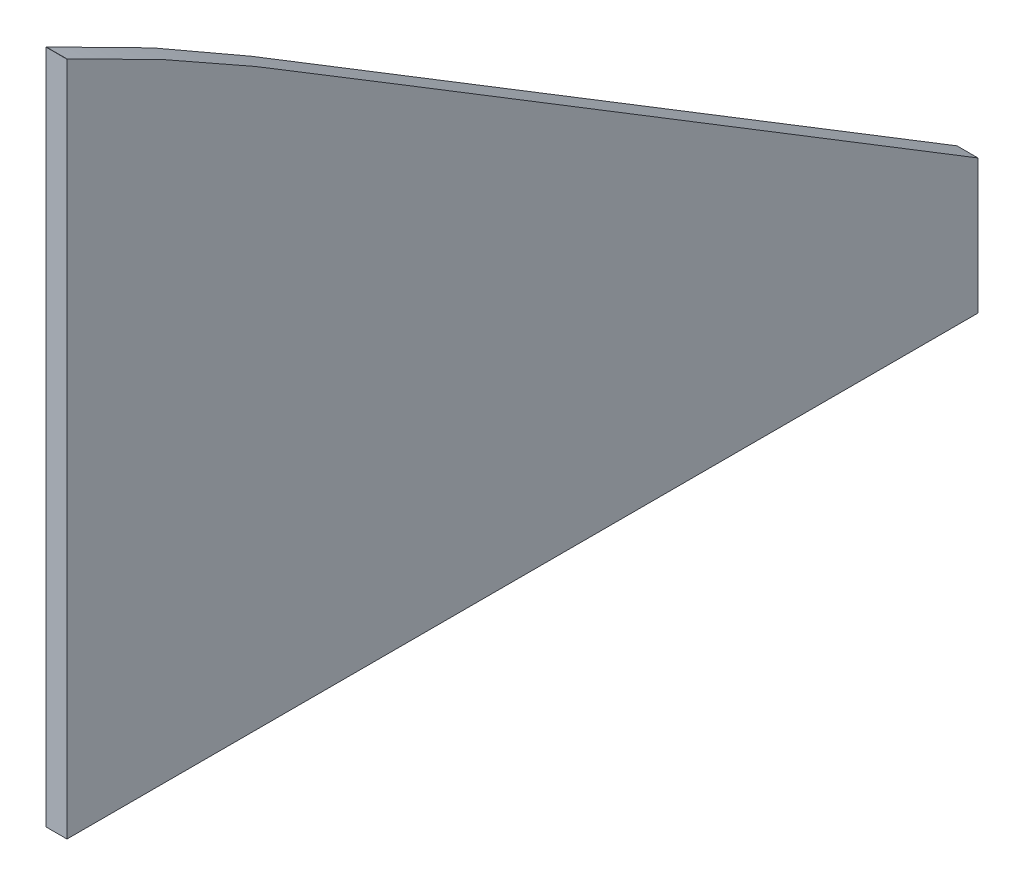
ISO-10303-21;
HEADER;
FILE_DESCRIPTION(('STEP AP214'),'2;1');
FILE_NAME('part.step','',(''),(''),'','','');
FILE_SCHEMA(('AUTOMOTIVE_DESIGN { 1 0 10303 214 1 1 1 1 }'));
ENDSEC;
DATA;
#1=APPLICATION_CONTEXT('core data for automotive mechanical design processes');
#2=APPLICATION_PROTOCOL_DEFINITION('international standard','automotive_design',2000,#1);
#3=PRODUCT_CONTEXT('',#1,'mechanical');
#4=PRODUCT('Part','Part','',(#3));
#5=PRODUCT_RELATED_PRODUCT_CATEGORY('part','',(#4));
#6=PRODUCT_DEFINITION_FORMATION('','',#4);
#7=PRODUCT_DEFINITION_CONTEXT('part definition',#1,'design');
#8=PRODUCT_DEFINITION('design','',#6,#7);
#9=PRODUCT_DEFINITION_SHAPE('','',#8);
#10=(LENGTH_UNIT() NAMED_UNIT(*) SI_UNIT(.MILLI.,.METRE.));
#11=(NAMED_UNIT(*) PLANE_ANGLE_UNIT() SI_UNIT($,.RADIAN.));
#12=(NAMED_UNIT(*) SI_UNIT($,.STERADIAN.) SOLID_ANGLE_UNIT());
#13=UNCERTAINTY_MEASURE_WITH_UNIT(LENGTH_MEASURE(1.E-05),#10,'distance_accuracy_value','');
#14=(GEOMETRIC_REPRESENTATION_CONTEXT(3) GLOBAL_UNCERTAINTY_ASSIGNED_CONTEXT((#13)) GLOBAL_UNIT_ASSIGNED_CONTEXT((#10,
#11,#12)) REPRESENTATION_CONTEXT('',''));
#15=CARTESIAN_POINT('',(0.,0.,0.));
#16=DIRECTION('',(0.,0.,1.));
#17=DIRECTION('',(1.,0.,0.));
#18=AXIS2_PLACEMENT_3D('',#15,#16,#17);
#19=CARTESIAN_POINT('',(710.,424.00019339282,182.938614186098));
#20=DIRECTION('',(1.,0.,0.));
#21=DIRECTION('',(0.,1.,0.));
#22=AXIS2_PLACEMENT_3D('',#19,#20,#21);
#23=PLANE('',#22);
#24=CARTESIAN_POINT('',(710.,327.113728556052,-34.1227716278049));
#25=CARTESIAN_POINT('',(710.,393.948717499599,75.437130923735));
#26=CARTESIAN_POINT('',(710.,460.783706443145,184.997033475275));
#27=CARTESIAN_POINT('',(710.,527.618695386692,294.556936026815));
#28=CARTESIAN_POINT('',(710.,530.739682456954,299.673044291176));
#29=CARTESIAN_POINT('',(710.,533.81640505228,304.787373011843));
#30=CARTESIAN_POINT('',(710.,536.841338937679,309.890563191029));
#31=CARTESIAN_POINT('',(710.,536.912160954527,310.010042900187));
#32=CARTESIAN_POINT('',(710.,537.042611539758,310.230138132512));
#33=CARTESIAN_POINT('',(710.,537.225130506718,310.538445208813));
#34=CARTESIAN_POINT('',(710.,546.500562042383,326.206302779104));
#35=CARTESIAN_POINT('',(710.,555.261116454356,341.70362097195));
#36=CARTESIAN_POINT('',(710.,563.692773588629,357.536212878907));
#37=CARTESIAN_POINT('',(710.,570.135366088416,369.633827410377));
#38=CARTESIAN_POINT('',(710.,575.897239710819,380.982203809807));
#39=CARTESIAN_POINT('',(710.,581.589691060234,392.853860253918));
#40=CARTESIAN_POINT('',(710.,582.708067356299,395.186243676656));
#41=CARTESIAN_POINT('',(710.,583.815706068801,397.523597262797));
#42=CARTESIAN_POINT('',(710.,584.911639993194,399.865461804627));
#43=(BOUNDED_CURVE() B_SPLINE_CURVE(3,(#24,#25,#26,#27,#28,#29,#30,#31,#32,#33,#34,#35,#36,#37,
#38,#39,#40,#41,#42),.UNSPECIFIED.,.F.,.F.) B_SPLINE_CURVE_WITH_KNOTS((4,3,3,3,3,3,4),
(0.0585691557129306,51.281799015553,53.673765268808,53.7297677735588,56.5757591096677,
58.7503686964292,59.1776067465671),
.UNSPECIFIED.) CURVE() GEOMETRIC_REPRESENTATION_ITEM() RATIONAL_B_SPLINE_CURVE((1.,1.,1.,1.,1.,
1.,1.,1.,1.,1.,1.,1.,1.,1.,1.,1.,1.,1.,1.)) REPRESENTATION_ITEM(''));
#44=CARTESIAN_POINT('',(710.,327.113728556052,-34.122771627805));
#45=VERTEX_POINT('',#44);
#46=CARTESIAN_POINT('',(710.,584.911639993194,399.865461804627));
#47=VERTEX_POINT('',#46);
#48=EDGE_CURVE('E102',#45,#47,#43,.T.);
#49=ORIENTED_EDGE('',*,*,#48,.T.);
#50=DIRECTION('',(0.,0.,1.));
#51=VECTOR('',#50,1.);
#52=CARTESIAN_POINT('',(710.,584.911639993194,-34.122771627805));
#53=LINE('',#52,#51);
#54=CARTESIAN_POINT('',(710.,584.911639993194,400.));
#55=VERTEX_POINT('',#54);
#56=EDGE_CURVE('E95',#47,#55,#53,.T.);
#57=ORIENTED_EDGE('',*,*,#56,.T.);
#58=DIRECTION('',(0.,-1.,0.));
#59=VECTOR('',#58,1.);
#60=CARTESIAN_POINT('',(710.,584.911639993194,400.));
#61=LINE('',#60,#59);
#62=CARTESIAN_POINT('',(710.,263.088746792446,400.));
#63=VERTEX_POINT('',#62);
#64=EDGE_CURVE('E91',#55,#63,#61,.T.);
#65=ORIENTED_EDGE('',*,*,#64,.T.);
#66=DIRECTION('',(0.,0.,-1.));
#67=VECTOR('',#66,1.);
#68=CARTESIAN_POINT('',(710.,263.088746792446,400.));
#69=LINE('',#68,#67);
#70=CARTESIAN_POINT('',(710.,263.088746792446,-34.122771627805));
#71=VERTEX_POINT('',#70);
#72=EDGE_CURVE('E10',#63,#71,#69,.T.);
#73=ORIENTED_EDGE('',*,*,#72,.T.);
#74=DIRECTION('',(0.,1.,0.));
#75=VECTOR('',#74,1.);
#76=CARTESIAN_POINT('',(710.,263.088746792446,-34.122771627805));
#77=LINE('',#76,#75);
#78=EDGE_CURVE('E135',#71,#45,#77,.T.);
#79=ORIENTED_EDGE('',*,*,#78,.T.);
#80=EDGE_LOOP('',(#49,#57,#65,#73,#79));
#81=FACE_BOUND('',#80,.T.);
#82=ADVANCED_FACE('F15',(#81),#23,.T.);
#83=CARTESIAN_POINT('',(700.,263.088746792446,400.));
#84=DIRECTION('',(0.,-1.,0.));
#85=DIRECTION('',(0.,0.,-1.));
#86=AXIS2_PLACEMENT_3D('',#83,#84,#85);
#87=PLANE('',#86);
#88=DIRECTION('',(0.,0.,-1.));
#89=VECTOR('',#88,1.);
#90=CARTESIAN_POINT('',(700.,263.088746792446,400.));
#91=LINE('',#90,#89);
#92=CARTESIAN_POINT('',(700.,263.088746792446,400.));
#93=VERTEX_POINT('',#92);
#94=CARTESIAN_POINT('',(700.,263.088746792446,-34.122771627805));
#95=VERTEX_POINT('',#94);
#96=EDGE_CURVE('E82',#93,#95,#91,.T.);
#97=ORIENTED_EDGE('',*,*,#96,.T.);
#98=DIRECTION('',(1.,0.,0.));
#99=VECTOR('',#98,1.);
#100=CARTESIAN_POINT('',(700.,263.088746792446,-34.122771627805));
#101=LINE('',#100,#99);
#102=EDGE_CURVE('E28',#95,#71,#101,.T.);
#103=ORIENTED_EDGE('',*,*,#102,.T.);
#104=ORIENTED_EDGE('',*,*,#72,.F.);
#105=DIRECTION('',(1.,0.,0.));
#106=VECTOR('',#105,1.);
#107=CARTESIAN_POINT('',(700.,263.088746792446,400.));
#108=LINE('',#107,#106);
#109=EDGE_CURVE('E86',#93,#63,#108,.T.);
#110=ORIENTED_EDGE('',*,*,#109,.F.);
#111=EDGE_LOOP('',(#97,#103,#104,#110));
#112=FACE_BOUND('',#111,.T.);
#113=ADVANCED_FACE('F17',(#112),#87,.T.);
#114=CARTESIAN_POINT('',(700.,263.088746792446,-34.122771627805));
#115=DIRECTION('',(0.,0.,-1.));
#116=DIRECTION('',(0.,-1.,0.));
#117=AXIS2_PLACEMENT_3D('',#114,#115,#116);
#118=PLANE('',#117);
#119=CARTESIAN_POINT('',(700.,327.113728556052,-34.122771627805));
#120=CARTESIAN_POINT('',(703.333333333334,327.113728556052,-34.122771627805));
#121=CARTESIAN_POINT('',(706.666666666666,327.113728556052,-34.122771627805));
#122=CARTESIAN_POINT('',(710.,327.113728556052,-34.122771627805));
#123=(BOUNDED_CURVE() B_SPLINE_CURVE(3,(#119,#120,#121,#122),.UNSPECIFIED.,.F.,
.F.) B_SPLINE_CURVE_WITH_KNOTS((4,4),(0.049999999999998,1.05000000000009),
.UNSPECIFIED.) CURVE() GEOMETRIC_REPRESENTATION_ITEM() RATIONAL_B_SPLINE_CURVE((1.,1.,1.,1.)) REPRESENTATION_ITEM(''));
#124=CARTESIAN_POINT('',(700.,327.113728556052,-34.122771627805));
#125=VERTEX_POINT('',#124);
#126=EDGE_CURVE('E112',#125,#45,#123,.T.);
#127=ORIENTED_EDGE('',*,*,#126,.T.);
#128=ORIENTED_EDGE('',*,*,#78,.F.);
#129=ORIENTED_EDGE('',*,*,#102,.F.);
#130=DIRECTION('',(0.,1.,0.));
#131=VECTOR('',#130,1.);
#132=CARTESIAN_POINT('',(700.,263.088746792446,-34.122771627805));
#133=LINE('',#132,#131);
#134=EDGE_CURVE('E125',#95,#125,#133,.T.);
#135=ORIENTED_EDGE('',*,*,#134,.T.);
#136=EDGE_LOOP('',(#127,#128,#129,#135));
#137=FACE_BOUND('',#136,.T.);
#138=ADVANCED_FACE('F161',(#137),#118,.T.);
#139=CARTESIAN_POINT('',(700.,584.911639993194,400.));
#140=DIRECTION('',(0.,0.,1.));
#141=DIRECTION('',(1.,0.,0.));
#142=AXIS2_PLACEMENT_3D('',#139,#140,#141);
#143=PLANE('',#142);
#144=DIRECTION('',(0.,-1.,0.));
#145=VECTOR('',#144,1.);
#146=CARTESIAN_POINT('',(700.,584.911639993194,400.));
#147=LINE('',#146,#145);
#148=CARTESIAN_POINT('',(700.,584.911639993194,400.));
#149=VERTEX_POINT('',#148);
#150=EDGE_CURVE('E73',#149,#93,#147,.T.);
#151=ORIENTED_EDGE('',*,*,#150,.T.);
#152=ORIENTED_EDGE('',*,*,#109,.T.);
#153=ORIENTED_EDGE('',*,*,#64,.F.);
#154=DIRECTION('',(1.,0.,0.));
#155=VECTOR('',#154,1.);
#156=CARTESIAN_POINT('',(700.,584.911639993194,400.));
#157=LINE('',#156,#155);
#158=EDGE_CURVE('E89',#149,#55,#157,.T.);
#159=ORIENTED_EDGE('',*,*,#158,.F.);
#160=EDGE_LOOP('',(#151,#152,#153,#159));
#161=FACE_BOUND('',#160,.T.);
#162=ADVANCED_FACE('F90',(#161),#143,.T.);
#163=CARTESIAN_POINT('',(700.,424.00019339282,182.938614186098));
#164=DIRECTION('',(1.,0.,0.));
#165=DIRECTION('',(0.,1.,0.));
#166=AXIS2_PLACEMENT_3D('',#163,#164,#165);
#167=PLANE('',#166);
#168=CARTESIAN_POINT('',(700.,584.911639993194,399.865461804627));
#169=CARTESIAN_POINT('',(700.,583.815706068801,397.523597262797));
#170=CARTESIAN_POINT('',(700.,582.708067356299,395.186243676656));
#171=CARTESIAN_POINT('',(700.,581.589691060234,392.853860253918));
#172=CARTESIAN_POINT('',(700.,575.897239710819,380.982203809807));
#173=CARTESIAN_POINT('',(700.,570.135366088416,369.633827410377));
#174=CARTESIAN_POINT('',(700.,563.692773588629,357.536212878907));
#175=CARTESIAN_POINT('',(700.,555.261116454356,341.70362097195));
#176=CARTESIAN_POINT('',(700.,546.500562042383,326.206302779104));
#177=CARTESIAN_POINT('',(700.,537.225130506718,310.538445208813));
#178=CARTESIAN_POINT('',(700.,537.042611539758,310.230138132512));
#179=CARTESIAN_POINT('',(700.,536.912160954527,310.010042900187));
#180=CARTESIAN_POINT('',(700.,536.841338937679,309.890563191029));
#181=CARTESIAN_POINT('',(700.,533.81640505228,304.787373011843));
#182=CARTESIAN_POINT('',(700.,530.739682456954,299.673044291176));
#183=CARTESIAN_POINT('',(700.,527.618695386692,294.556936026815));
#184=CARTESIAN_POINT('',(700.,460.783706443145,184.997033475275));
#185=CARTESIAN_POINT('',(700.,393.948717499598,75.4371309237349));
#186=CARTESIAN_POINT('',(700.,327.113728556052,-34.1227716278051));
#187=(BOUNDED_CURVE() B_SPLINE_CURVE(3,(#168,#169,#170,#171,#172,#173,#174,#175,#176,#177,#178,
#179,#180,#181,#182,#183,#184,#185,#186),.UNSPECIFIED.,.F.,.F.) B_SPLINE_CURVE_WITH_KNOTS((4,3,
3,3,3,3,4),(0.0700692870585055,0.895610685332444,5.09755439885545,10.5967922741532,
10.7050045133577,15.3269410770571,114.304306948254),
.UNSPECIFIED.) CURVE() GEOMETRIC_REPRESENTATION_ITEM() RATIONAL_B_SPLINE_CURVE((1.,1.,1.,1.,1.,
1.,1.,1.,1.,1.,1.,1.,1.,1.,1.,1.,1.,1.,1.)) REPRESENTATION_ITEM(''));
#188=CARTESIAN_POINT('',(700.,584.911639993194,399.865461804627));
#189=VERTEX_POINT('',#188);
#190=EDGE_CURVE('E19',#189,#125,#187,.T.);
#191=ORIENTED_EDGE('',*,*,#190,.T.);
#192=ORIENTED_EDGE('',*,*,#134,.F.);
#193=ORIENTED_EDGE('',*,*,#96,.F.);
#194=ORIENTED_EDGE('',*,*,#150,.F.);
#195=DIRECTION('',(0.,0.,1.));
#196=VECTOR('',#195,1.);
#197=CARTESIAN_POINT('',(700.,584.911639993194,-34.122771627805));
#198=LINE('',#197,#196);
#199=EDGE_CURVE('E78',#189,#149,#198,.T.);
#200=ORIENTED_EDGE('',*,*,#199,.F.);
#201=EDGE_LOOP('',(#191,#192,#193,#194,#200));
#202=FACE_BOUND('',#201,.T.);
#203=ADVANCED_FACE('F76',(#202),#167,.F.);
#204=CARTESIAN_POINT('',(700.,584.911639993194,-34.122771627805));
#205=DIRECTION('',(0.,1.,0.));
#206=DIRECTION('',(1.,0.,0.));
#207=AXIS2_PLACEMENT_3D('',#204,#205,#206);
#208=PLANE('',#207);
#209=CARTESIAN_POINT('',(710.,584.911639993194,399.865461804627));
#210=CARTESIAN_POINT('',(706.666666666666,584.911639993194,399.865461804627));
#211=CARTESIAN_POINT('',(703.333333333333,584.911639993194,399.865461804627));
#212=CARTESIAN_POINT('',(700.,584.911639993194,399.865461804627));
#213=(BOUNDED_CURVE() B_SPLINE_CURVE(3,(#209,#210,#211,#212),.UNSPECIFIED.,.F.,
.F.) B_SPLINE_CURVE_WITH_KNOTS((4,4),(0.0499999999999829,1.04999999999998),
.UNSPECIFIED.) CURVE() GEOMETRIC_REPRESENTATION_ITEM() RATIONAL_B_SPLINE_CURVE((1.,1.,1.,1.)) REPRESENTATION_ITEM(''));
#214=EDGE_CURVE('E99',#47,#189,#213,.T.);
#215=ORIENTED_EDGE('',*,*,#214,.T.);
#216=ORIENTED_EDGE('',*,*,#199,.T.);
#217=ORIENTED_EDGE('',*,*,#158,.T.);
#218=ORIENTED_EDGE('',*,*,#56,.F.);
#219=EDGE_LOOP('',(#215,#216,#217,#218));
#220=FACE_BOUND('',#219,.T.);
#221=ADVANCED_FACE('F97',(#220),#208,.T.);
#222=CARTESIAN_POINT('',(-362.256097932323,-572.204246657164,943.480926716199));
#223=CARTESIAN_POINT('',(1771.25609793232,-572.204246657164,943.480926716199));
#224=CARTESIAN_POINT('',(-362.256097932323,-229.804955533969,868.942411403719));
#225=CARTESIAN_POINT('',(1771.25609793232,-229.804955533969,868.942411403719));
#226=CARTESIAN_POINT('',(-362.256097932323,112.594335589226,794.40389609124));
#227=CARTESIAN_POINT('',(1771.25609793232,112.594335589226,794.40389609124));
#228=CARTESIAN_POINT('',(-362.256097932323,454.993626712421,719.86538077876));
#229=CARTESIAN_POINT('',(1771.25609793232,454.993626712421,719.86538077876));
#230=CARTESIAN_POINT('',(-362.256097932323,468.480912210163,716.929270037118));
#231=CARTESIAN_POINT('',(1771.25609793232,468.480912210163,716.929270037118));
#232=CARTESIAN_POINT('',(-362.256097932323,481.509221547537,713.534209086195));
#233=CARTESIAN_POINT('',(1771.25609793232,481.509221547537,713.534209086195));
#234=CARTESIAN_POINT('',(-362.256097932323,505.778577342356,705.930079253447));
#235=CARTESIAN_POINT('',(1771.25609793232,505.778577342356,705.930079253447));
#236=CARTESIAN_POINT('',(-362.256097932323,517.346606095361,701.68960208267));
#237=CARTESIAN_POINT('',(1771.25609793232,517.346606095361,701.68960208267));
#238=CARTESIAN_POINT('',(-362.256097932323,549.587093772607,687.521897093088));
#239=CARTESIAN_POINT('',(1771.25609793232,549.587093772607,687.521897093088));
#240=CARTESIAN_POINT('',(-362.256097932323,569.212922758717,675.850530006688));
#241=CARTESIAN_POINT('',(1771.25609793232,569.212922758717,675.850530006688));
#242=CARTESIAN_POINT('',(-362.256097932323,589.661749786182,657.05552894535));
#243=CARTESIAN_POINT('',(1771.25609793232,589.661749786182,657.05552894535));
#244=CARTESIAN_POINT('',(-362.256097932323,593.486469066028,653.113332671797));
#245=CARTESIAN_POINT('',(1771.25609793232,593.486469066028,653.113332671797));
#246=CARTESIAN_POINT('',(-362.256097932323,603.206027635225,641.831734383769));
#247=CARTESIAN_POINT('',(1771.25609793232,603.206027635225,641.831734383769));
#248=CARTESIAN_POINT('',(-362.256097932323,608.417423885158,634.335573435164));
#249=CARTESIAN_POINT('',(1771.25609793232,608.417423885158,634.335573435164));
#250=CARTESIAN_POINT('',(-362.256097932323,616.407741978553,619.611196325145));
#251=CARTESIAN_POINT('',(1771.25609793232,616.407741978553,619.611196325145));
#252=CARTESIAN_POINT('',(-362.256097932323,618.688401111678,614.005256601817));
#253=CARTESIAN_POINT('',(1771.25609793232,618.688401111678,614.005256601817));
#254=CARTESIAN_POINT('',(-362.256097932323,621.298027563217,606.9397748753));
#255=CARTESIAN_POINT('',(1771.25609793232,621.298027563217,606.9397748753));
#256=CARTESIAN_POINT('',(-362.256097932323,622.3037982907,603.872941193098));
#257=CARTESIAN_POINT('',(1771.25609793232,622.3037982907,603.872941193098));
#258=CARTESIAN_POINT('',(-362.256097932323,624.214729362039,597.206111280268));
#259=CARTESIAN_POINT('',(1771.25609793232,624.214729362039,597.206111280268));
#260=CARTESIAN_POINT('',(-362.256097932323,625.08166794729,593.640291488809));
#261=CARTESIAN_POINT('',(1771.25609793232,625.08166794729,593.640291488809));
#262=CARTESIAN_POINT('',(-362.256097932323,627.509269020286,581.589934632535));
#263=CARTESIAN_POINT('',(1771.25609793232,627.509269020286,581.589934632535));
#264=CARTESIAN_POINT('',(-362.256097932323,628.433907017217,573.03902661471));
#265=CARTESIAN_POINT('',(1771.25609793232,628.433907017217,573.03902661471));
#266=CARTESIAN_POINT('',(-362.256097932323,628.833198184814,562.151204848578));
#267=CARTESIAN_POINT('',(1771.25609793232,628.833198184814,562.151204848578));
#268=CARTESIAN_POINT('',(-362.256097932323,628.868088907446,559.809652350947));
#269=CARTESIAN_POINT('',(1771.25609793232,628.868088907446,559.809652350947));
#270=CARTESIAN_POINT('',(-362.256097932323,628.847508177946,546.74086786728));
#271=CARTESIAN_POINT('',(1771.25609793232,628.847508177946,546.74086786728));
#272=CARTESIAN_POINT('',(-362.256097932323,627.897194469519,535.80856309446));
#273=CARTESIAN_POINT('',(1771.25609793232,627.897194469519,535.80856309446));
#274=CARTESIAN_POINT('',(-362.256097932323,625.284219654465,518.27171861074));
#275=CARTESIAN_POINT('',(1771.25609793232,625.284219654465,518.27171861074));
#276=CARTESIAN_POINT('',(-362.256097932323,624.069409908822,511.799497803705));
#277=CARTESIAN_POINT('',(1771.25609793232,624.069409908822,511.799497803705));
#278=CARTESIAN_POINT('',(-362.256097932323,618.919931047952,488.5049481614));
#279=CARTESIAN_POINT('',(1771.25609793232,618.919931047952,488.5049481614));
#280=CARTESIAN_POINT('',(-362.256097932323,613.801330356614,471.636055808182));
#281=CARTESIAN_POINT('',(1771.25609793232,613.801330356614,471.636055808182));
#282=CARTESIAN_POINT('',(-362.256097932323,600.635362195258,434.738638466239));
#283=CARTESIAN_POINT('',(1771.25609793232,600.635362195258,434.738638466239));
#284=CARTESIAN_POINT('',(-362.256097932323,591.537279443618,413.599641725919));
#285=CARTESIAN_POINT('',(1771.25609793232,591.537279443618,413.599641725919));
#286=CARTESIAN_POINT('',(-362.256097932323,575.897239710819,380.982203809807));
#287=CARTESIAN_POINT('',(1771.25609793232,575.897239710819,380.982203809807));
#288=CARTESIAN_POINT('',(-362.256097932323,570.135366088416,369.633827410377));
#289=CARTESIAN_POINT('',(1771.25609793232,570.135366088416,369.633827410377));
#290=CARTESIAN_POINT('',(-362.256097932323,555.261116454356,341.70362097195));
#291=CARTESIAN_POINT('',(1771.25609793232,555.261116454356,341.70362097195));
#292=CARTESIAN_POINT('',(-362.256097932323,546.500562042383,326.206302779104));
#293=CARTESIAN_POINT('',(1771.25609793232,546.500562042383,326.206302779104));
#294=CARTESIAN_POINT('',(-362.256097932323,537.042611539758,310.230138132512));
#295=CARTESIAN_POINT('',(1771.25609793232,537.042611539758,310.230138132512));
#296=CARTESIAN_POINT('',(-362.256097932323,536.912160954527,310.010042900187));
#297=CARTESIAN_POINT('',(1771.25609793232,536.912160954527,310.010042900187));
#298=CARTESIAN_POINT('',(-362.256097932323,533.81640505228,304.787373011843));
#299=CARTESIAN_POINT('',(1771.25609793232,533.81640505228,304.787373011843));
#300=CARTESIAN_POINT('',(-362.256097932323,530.739682456954,299.673044291176));
#301=CARTESIAN_POINT('',(1771.25609793232,530.739682456954,299.673044291176));
#302=CARTESIAN_POINT('',(-362.256097932323,527.618695386692,294.556936026815));
#303=CARTESIAN_POINT('',(1771.25609793232,527.618695386692,294.556936026815));
#304=CARTESIAN_POINT('',(-362.256097932323,345.128070951823,-4.59258648663798));
#305=CARTESIAN_POINT('',(1771.25609793232,345.128070951823,-4.59258648663798));
#306=CARTESIAN_POINT('',(-362.256097932323,162.637446516954,-303.742109000091));
#307=CARTESIAN_POINT('',(1771.25609793232,162.637446516954,-303.742109000091));
#308=CARTESIAN_POINT('',(-362.256097932323,-19.8531779179146,-602.891631513543));
#309=CARTESIAN_POINT('',(1771.25609793232,-19.8531779179146,-602.891631513543));
#310=(BOUNDED_SURFACE() B_SPLINE_SURFACE(3,1,((#222,#223),(#224,#225),(#226,#227),(#228,#229),
(#230,#231),(#232,#233),(#234,#235),(#236,#237),(#238,#239),(#240,#241),(#242,#243),(#244,#245),
(#246,#247),(#248,#249),(#250,#251),(#252,#253),(#254,#255),(#256,#257),(#258,#259),(#260,#261),
(#262,#263),(#264,#265),(#266,#267),(#268,#269),(#270,#271),(#272,#273),(#274,#275),(#276,#277),
(#278,#279),(#280,#281),(#282,#283),(#284,#285),(#286,#287),(#288,#289),(#290,#291),(#292,#293),
(#294,#295),(#296,#297),(#298,#299),(#300,#301),(#302,#303),(#304,#305),(#306,#307),(#308,
#309)),.UNSPECIFIED.,.F.,.F.,.F.) B_SPLINE_SURFACE_WITH_KNOTS((4,3,2,2,2,2,2,2,2,2,2,2,2,2,2,2,
2,2,2,3,4),(2,2),(-46.3364506945031,-26.2807830751005,-25.4907799353644,-24.7427648866956,
-23.3179806242579,-22.9417994550685,-22.310240789164,-21.7887205336533,-21.4061063233963,
-20.9825996302386,-20.0092352682504,-19.7257501383661,-18.336090548599,-17.4612756949883,
-15.3612157368685,-12.5221468306401,-10.8975056609937,-8.77127816652847,-8.72943894381224,
-6.9424115734278,97.5488065450274),(-106.225609793232,107.125609793232),
.UNSPECIFIED.) GEOMETRIC_REPRESENTATION_ITEM() RATIONAL_B_SPLINE_SURFACE(((1.,1.),(1.,1.),(1.,
1.),(1.,1.),(1.,1.),(1.,1.),(1.,1.),(1.,1.),(1.,1.),(1.,1.),(1.,1.),(1.,1.),(1.,1.),(1.,1.),(1.,
1.),(1.,1.),(1.,1.),(1.,1.),(1.,1.),(1.,1.),(1.,1.),(1.,1.),(1.,1.),(1.,1.),(1.,1.),(1.,1.),(1.,
1.),(1.,1.),(1.,1.),(1.,1.),(1.,1.),(1.,1.),(1.,1.),(1.,1.),(1.,1.),(1.,1.),(1.,1.),(1.,1.),(1.,
1.),(1.,1.),(1.,1.),(1.,1.),(1.,1.),(1.,1.))) REPRESENTATION_ITEM('') SURFACE());
#311=ORIENTED_EDGE('',*,*,#126,.F.);
#312=ORIENTED_EDGE('',*,*,#190,.F.);
#313=ORIENTED_EDGE('',*,*,#214,.F.);
#314=ORIENTED_EDGE('',*,*,#48,.F.);
#315=EDGE_LOOP('',(#311,#312,#313,#314));
#316=FACE_BOUND('',#315,.T.);
#317=ADVANCED_FACE('F153',(#316),#310,.F.);
#318=CLOSED_SHELL('',(#82,#113,#138,#162,#203,#221,#317));
#319=MANIFOLD_SOLID_BREP('B1',#318);
#320=ADVANCED_BREP_SHAPE_REPRESENTATION('',(#18,#319),#14);
#321=SHAPE_DEFINITION_REPRESENTATION(#9,#320);
ENDSEC;
END-ISO-10303-21;
